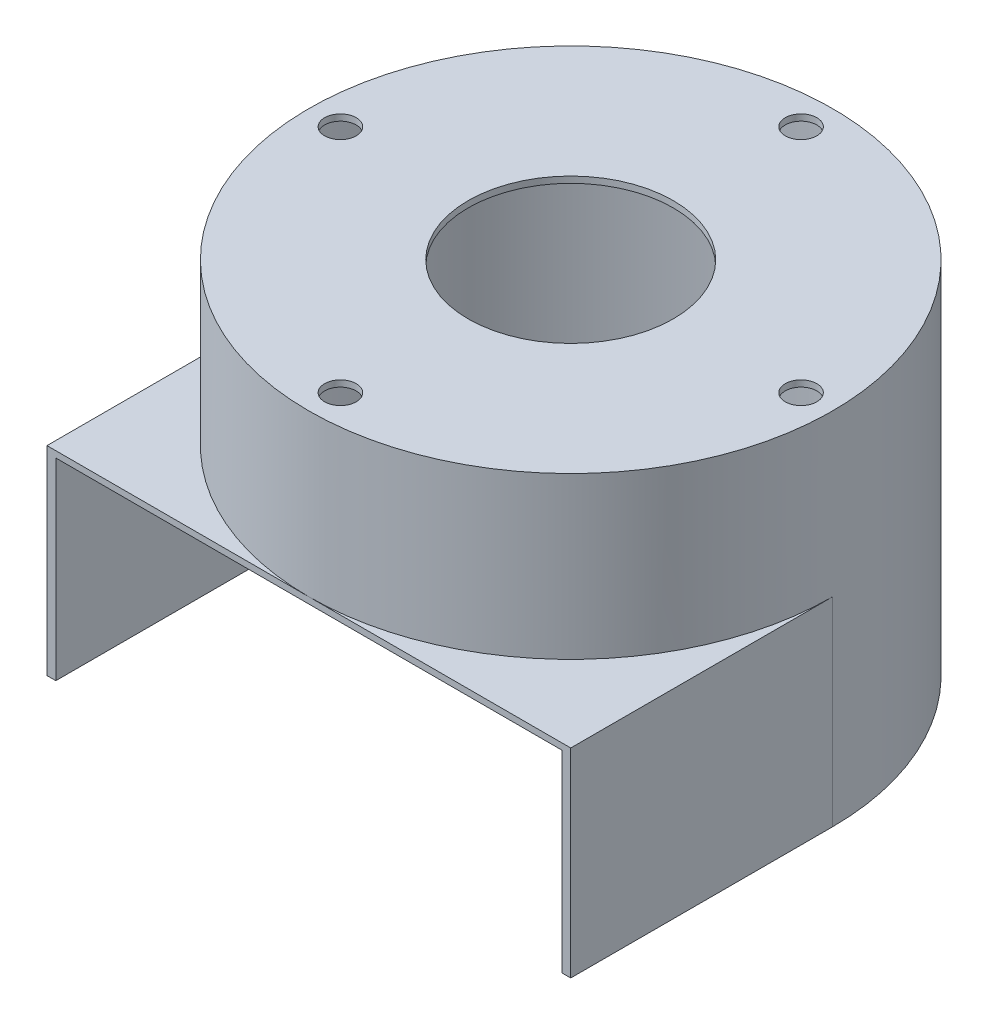
ISO-10303-21;
HEADER;
FILE_DESCRIPTION(('STEP AP214'),'2;1');
FILE_NAME('part.step','',(''),(''),'','','');
FILE_SCHEMA(('AUTOMOTIVE_DESIGN { 1 0 10303 214 1 1 1 1 }'));
ENDSEC;
DATA;
#1=APPLICATION_CONTEXT('core data for automotive mechanical design processes');
#2=APPLICATION_PROTOCOL_DEFINITION('international standard','automotive_design',2000,#1);
#3=PRODUCT_CONTEXT('',#1,'mechanical');
#4=PRODUCT('Part','Part','',(#3));
#5=PRODUCT_RELATED_PRODUCT_CATEGORY('part','',(#4));
#6=PRODUCT_DEFINITION_FORMATION('','',#4);
#7=PRODUCT_DEFINITION_CONTEXT('part definition',#1,'design');
#8=PRODUCT_DEFINITION('design','',#6,#7);
#9=PRODUCT_DEFINITION_SHAPE('','',#8);
#10=(LENGTH_UNIT() NAMED_UNIT(*) SI_UNIT(.MILLI.,.METRE.));
#11=(NAMED_UNIT(*) PLANE_ANGLE_UNIT() SI_UNIT($,.RADIAN.));
#12=(NAMED_UNIT(*) SI_UNIT($,.STERADIAN.) SOLID_ANGLE_UNIT());
#13=UNCERTAINTY_MEASURE_WITH_UNIT(LENGTH_MEASURE(1.E-05),#10,'distance_accuracy_value','');
#14=(GEOMETRIC_REPRESENTATION_CONTEXT(3) GLOBAL_UNCERTAINTY_ASSIGNED_CONTEXT((#13)) GLOBAL_UNIT_ASSIGNED_CONTEXT((#10,
#11,#12)) REPRESENTATION_CONTEXT('',''));
#15=CARTESIAN_POINT('',(0.,0.,0.));
#16=DIRECTION('',(0.,0.,1.));
#17=DIRECTION('',(1.,0.,0.));
#18=AXIS2_PLACEMENT_3D('',#15,#16,#17);
#19=CARTESIAN_POINT('',(0.,63.14,0.));
#20=DIRECTION('',(0.,1.,0.));
#21=DIRECTION('',(0.,0.,1.));
#22=AXIS2_PLACEMENT_3D('',#19,#20,#21);
#23=PLANE('',#22);
#24=CARTESIAN_POINT('',(0.,63.14,0.));
#25=DIRECTION('',(0.,1.,0.));
#26=DIRECTION('',(0.,0.,1.));
#27=AXIS2_PLACEMENT_3D('',#24,#25,#26);
#28=CIRCLE('',#27,83.);
#29=CARTESIAN_POINT('',(0.,63.14,83.));
#30=VERTEX_POINT('',#29);
#31=CARTESIAN_POINT('',(83.,63.14,0.));
#32=VERTEX_POINT('',#31);
#33=EDGE_CURVE('E57',#30,#32,#28,.T.);
#34=ORIENTED_EDGE('',*,*,#33,.F.);
#35=DIRECTION('',(1.,0.,0.));
#36=VECTOR('',#35,1.);
#37=CARTESIAN_POINT('',(-83.,63.14,83.));
#38=LINE('',#37,#36);
#39=CARTESIAN_POINT('',(83.,63.14,83.));
#40=VERTEX_POINT('',#39);
#41=EDGE_CURVE('E196',#30,#40,#38,.T.);
#42=ORIENTED_EDGE('',*,*,#41,.T.);
#43=DIRECTION('',(0.,0.,-1.));
#44=VECTOR('',#43,1.);
#45=CARTESIAN_POINT('',(83.,63.14,83.));
#46=LINE('',#45,#44);
#47=EDGE_CURVE('E154',#40,#32,#46,.T.);
#48=ORIENTED_EDGE('',*,*,#47,.T.);
#49=EDGE_LOOP('',(#34,#42,#48));
#50=FACE_BOUND('',#49,.T.);
#51=ADVANCED_FACE('F44',(#50),#23,.T.);
#52=CARTESIAN_POINT('',(0.,0.,0.));
#53=DIRECTION('',(0.,1.,0.));
#54=DIRECTION('',(0.,0.,1.));
#55=AXIS2_PLACEMENT_3D('',#52,#53,#54);
#56=PLANE('',#55);
#57=DIRECTION('',(1.,0.,0.));
#58=VECTOR('',#57,1.);
#59=CARTESIAN_POINT('',(0.,0.,83.));
#60=LINE('',#59,#58);
#61=CARTESIAN_POINT('',(80.2,0.,83.));
#62=VERTEX_POINT('',#61);
#63=CARTESIAN_POINT('',(83.,0.,83.));
#64=VERTEX_POINT('',#63);
#65=EDGE_CURVE('E87',#62,#64,#60,.T.);
#66=ORIENTED_EDGE('',*,*,#65,.F.);
#67=DIRECTION('',(0.,0.,-1.));
#68=VECTOR('',#67,1.);
#69=CARTESIAN_POINT('',(80.2,0.,80.));
#70=LINE('',#69,#68);
#71=CARTESIAN_POINT('',(80.2,0.,0.));
#72=VERTEX_POINT('',#71);
#73=EDGE_CURVE('E146',#62,#72,#70,.T.);
#74=ORIENTED_EDGE('',*,*,#73,.T.);
#75=CARTESIAN_POINT('',(0.,0.,0.));
#76=DIRECTION('',(0.,1.,0.));
#77=DIRECTION('',(0.,0.,1.));
#78=AXIS2_PLACEMENT_3D('',#75,#76,#77);
#79=CIRCLE('',#78,80.2);
#80=CARTESIAN_POINT('',(-80.2,0.,0.));
#81=VERTEX_POINT('',#80);
#82=EDGE_CURVE('E65',#72,#81,#79,.T.);
#83=ORIENTED_EDGE('',*,*,#82,.T.);
#84=DIRECTION('',(0.,0.,1.));
#85=VECTOR('',#84,1.);
#86=CARTESIAN_POINT('',(-80.2,0.,0.));
#87=LINE('',#86,#85);
#88=CARTESIAN_POINT('',(-80.2,0.,83.));
#89=VERTEX_POINT('',#88);
#90=EDGE_CURVE('E151',#81,#89,#87,.T.);
#91=ORIENTED_EDGE('',*,*,#90,.T.);
#92=CARTESIAN_POINT('',(-83.,0.,83.));
#93=VERTEX_POINT('',#92);
#94=EDGE_CURVE('E128',#93,#89,#60,.T.);
#95=ORIENTED_EDGE('',*,*,#94,.F.);
#96=DIRECTION('',(0.,0.,1.));
#97=VECTOR('',#96,1.);
#98=CARTESIAN_POINT('',(-83.,0.,0.));
#99=LINE('',#98,#97);
#100=CARTESIAN_POINT('',(-83.,0.,0.));
#101=VERTEX_POINT('',#100);
#102=EDGE_CURVE('E112',#101,#93,#99,.T.);
#103=ORIENTED_EDGE('',*,*,#102,.F.);
#104=CARTESIAN_POINT('',(0.,0.,0.));
#105=DIRECTION('',(0.,1.,0.));
#106=DIRECTION('',(0.,0.,1.));
#107=AXIS2_PLACEMENT_3D('',#104,#105,#106);
#108=CIRCLE('',#107,83.);
#109=CARTESIAN_POINT('',(83.,0.,0.));
#110=VERTEX_POINT('',#109);
#111=EDGE_CURVE('E99',#110,#101,#108,.T.);
#112=ORIENTED_EDGE('',*,*,#111,.F.);
#113=DIRECTION('',(0.,0.,-1.));
#114=VECTOR('',#113,1.);
#115=CARTESIAN_POINT('',(83.,0.,83.));
#116=LINE('',#115,#114);
#117=EDGE_CURVE('E113',#64,#110,#116,.T.);
#118=ORIENTED_EDGE('',*,*,#117,.F.);
#119=EDGE_LOOP('',(#66,#74,#83,#91,#95,#103,#112,#118));
#120=FACE_BOUND('',#119,.T.);
#121=ADVANCED_FACE('F125',(#120),#56,.F.);
#122=CARTESIAN_POINT('',(0.,61.14,83.));
#123=DIRECTION('',(0.,0.,-1.));
#124=DIRECTION('',(-1.,0.,0.));
#125=AXIS2_PLACEMENT_3D('',#122,#123,#124);
#126=PLANE('',#125);
#127=DIRECTION('',(1.,0.,0.));
#128=VECTOR('',#127,1.);
#129=CARTESIAN_POINT('',(-80.2,61.14,83.));
#130=LINE('',#129,#128);
#131=CARTESIAN_POINT('',(-80.2,61.14,83.));
#132=VERTEX_POINT('',#131);
#133=CARTESIAN_POINT('',(80.2,61.14,83.));
#134=VERTEX_POINT('',#133);
#135=EDGE_CURVE('E235',#132,#134,#130,.T.);
#136=ORIENTED_EDGE('',*,*,#135,.T.);
#137=DIRECTION('',(0.,-1.,0.));
#138=VECTOR('',#137,1.);
#139=CARTESIAN_POINT('',(80.2,61.14,83.));
#140=LINE('',#139,#138);
#141=EDGE_CURVE('E169',#134,#62,#140,.T.);
#142=ORIENTED_EDGE('',*,*,#141,.T.);
#143=ORIENTED_EDGE('',*,*,#65,.T.);
#144=DIRECTION('',(0.,-1.,0.));
#145=VECTOR('',#144,1.);
#146=CARTESIAN_POINT('',(83.,61.14,83.));
#147=LINE('',#146,#145);
#148=EDGE_CURVE('E55',#40,#64,#147,.T.);
#149=ORIENTED_EDGE('',*,*,#148,.F.);
#150=ORIENTED_EDGE('',*,*,#41,.F.);
#151=CARTESIAN_POINT('',(-83.,63.14,83.));
#152=VERTEX_POINT('',#151);
#153=EDGE_CURVE('E197',#152,#30,#38,.T.);
#154=ORIENTED_EDGE('',*,*,#153,.F.);
#155=DIRECTION('',(0.,-1.,0.));
#156=VECTOR('',#155,1.);
#157=CARTESIAN_POINT('',(-83.,61.14,83.));
#158=LINE('',#157,#156);
#159=EDGE_CURVE('E123',#152,#93,#158,.T.);
#160=ORIENTED_EDGE('',*,*,#159,.T.);
#161=ORIENTED_EDGE('',*,*,#94,.T.);
#162=DIRECTION('',(0.,1.,0.));
#163=VECTOR('',#162,1.);
#164=CARTESIAN_POINT('',(-80.2,0.,83.));
#165=LINE('',#164,#163);
#166=EDGE_CURVE('E507',#89,#132,#165,.T.);
#167=ORIENTED_EDGE('',*,*,#166,.T.);
#168=EDGE_LOOP('',(#136,#142,#143,#149,#150,#154,#160,#161,#167));
#169=FACE_BOUND('',#168,.T.);
#170=ADVANCED_FACE('F233',(#169),#126,.F.);
#171=CARTESIAN_POINT('',(83.,61.14,83.));
#172=DIRECTION('',(-1.,0.,0.));
#173=DIRECTION('',(0.,0.,1.));
#174=AXIS2_PLACEMENT_3D('',#171,#172,#173);
#175=PLANE('',#174);
#176=ORIENTED_EDGE('',*,*,#117,.T.);
#177=DIRECTION('',(0.,-1.,0.));
#178=VECTOR('',#177,1.);
#179=CARTESIAN_POINT('',(83.,61.14,0.));
#180=LINE('',#179,#178);
#181=EDGE_CURVE('E107',#32,#110,#180,.T.);
#182=ORIENTED_EDGE('',*,*,#181,.F.);
#183=ORIENTED_EDGE('',*,*,#47,.F.);
#184=ORIENTED_EDGE('',*,*,#148,.T.);
#185=EDGE_LOOP('',(#176,#182,#183,#184));
#186=FACE_BOUND('',#185,.T.);
#187=ADVANCED_FACE('F207',(#186),#175,.F.);
#188=CARTESIAN_POINT('',(0.,61.14,0.));
#189=DIRECTION('',(0.,-1.,0.));
#190=DIRECTION('',(0.,0.,-1.));
#191=AXIS2_PLACEMENT_3D('',#188,#189,#190);
#192=CYLINDRICAL_SURFACE('',#191,83.);
#193=ORIENTED_EDGE('',*,*,#111,.T.);
#194=DIRECTION('',(0.,-1.,0.));
#195=VECTOR('',#194,1.);
#196=CARTESIAN_POINT('',(-83.,61.14,0.));
#197=LINE('',#196,#195);
#198=CARTESIAN_POINT('',(-83.,63.14,0.));
#199=VERTEX_POINT('',#198);
#200=EDGE_CURVE('E103',#199,#101,#197,.T.);
#201=ORIENTED_EDGE('',*,*,#200,.F.);
#202=EDGE_CURVE('E12',#199,#30,#28,.T.);
#203=ORIENTED_EDGE('',*,*,#202,.T.);
#204=ORIENTED_EDGE('',*,*,#33,.T.);
#205=ORIENTED_EDGE('',*,*,#181,.T.);
#206=EDGE_LOOP('',(#193,#201,#203,#204,#205));
#207=FACE_BOUND('',#206,.T.);
#208=CARTESIAN_POINT('',(0.,114.15,0.));
#209=DIRECTION('',(0.,1.,0.));
#210=DIRECTION('',(0.,0.,1.));
#211=AXIS2_PLACEMENT_3D('',#208,#209,#210);
#212=CIRCLE('',#211,83.);
#213=CARTESIAN_POINT('',(0.,114.15,83.));
#214=VERTEX_POINT('',#213);
#215=EDGE_CURVE('E180',#214,#214,#212,.T.);
#216=ORIENTED_EDGE('',*,*,#215,.F.);
#217=EDGE_LOOP('',(#216));
#218=FACE_BOUND('',#217,.T.);
#219=ADVANCED_FACE('F101',(#207,#218),#192,.T.);
#220=CARTESIAN_POINT('',(-83.,61.14,0.));
#221=DIRECTION('',(1.,0.,0.));
#222=DIRECTION('',(0.,0.,-1.));
#223=AXIS2_PLACEMENT_3D('',#220,#221,#222);
#224=PLANE('',#223);
#225=ORIENTED_EDGE('',*,*,#102,.T.);
#226=ORIENTED_EDGE('',*,*,#159,.F.);
#227=DIRECTION('',(0.,0.,1.));
#228=VECTOR('',#227,1.);
#229=CARTESIAN_POINT('',(-83.,63.14,0.));
#230=LINE('',#229,#228);
#231=EDGE_CURVE('E121',#199,#152,#230,.T.);
#232=ORIENTED_EDGE('',*,*,#231,.F.);
#233=ORIENTED_EDGE('',*,*,#200,.T.);
#234=EDGE_LOOP('',(#225,#226,#232,#233));
#235=FACE_BOUND('',#234,.T.);
#236=ADVANCED_FACE('F117',(#235),#224,.F.);
#237=CARTESIAN_POINT('',(0.,61.14,0.));
#238=DIRECTION('',(0.,-1.,0.));
#239=DIRECTION('',(0.,0.,-1.));
#240=AXIS2_PLACEMENT_3D('',#237,#238,#239);
#241=CYLINDRICAL_SURFACE('',#240,80.2);
#242=ORIENTED_EDGE('',*,*,#82,.F.);
#243=DIRECTION('',(0.,1.,0.));
#244=VECTOR('',#243,1.);
#245=CARTESIAN_POINT('',(80.2,61.14,0.));
#246=LINE('',#245,#244);
#247=CARTESIAN_POINT('',(80.2,61.14,0.));
#248=VERTEX_POINT('',#247);
#249=EDGE_CURVE('E139',#248,#72,#246,.F.);
#250=ORIENTED_EDGE('',*,*,#249,.F.);
#251=CARTESIAN_POINT('',(0.,61.14,0.));
#252=DIRECTION('',(0.,1.,0.));
#253=DIRECTION('',(0.,0.,1.));
#254=AXIS2_PLACEMENT_3D('',#251,#252,#253);
#255=CIRCLE('',#254,80.2);
#256=CARTESIAN_POINT('',(-80.2,61.14,0.));
#257=VERTEX_POINT('',#256);
#258=EDGE_CURVE('E78',#257,#248,#255,.T.);
#259=ORIENTED_EDGE('',*,*,#258,.F.);
#260=DIRECTION('',(0.,-1.,0.));
#261=VECTOR('',#260,1.);
#262=CARTESIAN_POINT('',(-80.2,61.14,0.));
#263=LINE('',#262,#261);
#264=EDGE_CURVE('E142',#257,#81,#263,.T.);
#265=ORIENTED_EDGE('',*,*,#264,.T.);
#266=EDGE_LOOP('',(#242,#250,#259,#265));
#267=FACE_BOUND('',#266,.T.);
#268=CARTESIAN_POINT('',(0.,112.15,0.));
#269=DIRECTION('',(0.,1.,0.));
#270=DIRECTION('',(0.,0.,1.));
#271=AXIS2_PLACEMENT_3D('',#268,#269,#270);
#272=CIRCLE('',#271,80.2);
#273=CARTESIAN_POINT('',(0.,112.15,80.2));
#274=VERTEX_POINT('',#273);
#275=EDGE_CURVE('E48',#274,#274,#272,.T.);
#276=ORIENTED_EDGE('',*,*,#275,.T.);
#277=EDGE_LOOP('',(#276));
#278=FACE_BOUND('',#277,.T.);
#279=ADVANCED_FACE('F46',(#267,#278),#241,.F.);
#280=CARTESIAN_POINT('',(-80.2,61.14,0.));
#281=DIRECTION('',(1.,0.,0.));
#282=DIRECTION('',(0.,0.,-1.));
#283=AXIS2_PLACEMENT_3D('',#280,#281,#282);
#284=PLANE('',#283);
#285=ORIENTED_EDGE('',*,*,#90,.F.);
#286=ORIENTED_EDGE('',*,*,#264,.F.);
#287=DIRECTION('',(0.,0.,1.));
#288=VECTOR('',#287,1.);
#289=CARTESIAN_POINT('',(-80.2,61.14,0.));
#290=LINE('',#289,#288);
#291=EDGE_CURVE('E150',#257,#132,#290,.T.);
#292=ORIENTED_EDGE('',*,*,#291,.T.);
#293=ORIENTED_EDGE('',*,*,#166,.F.);
#294=EDGE_LOOP('',(#285,#286,#292,#293));
#295=FACE_BOUND('',#294,.T.);
#296=ADVANCED_FACE('F175',(#295),#284,.T.);
#297=CARTESIAN_POINT('',(80.2,61.14,80.));
#298=DIRECTION('',(-1.,0.,0.));
#299=DIRECTION('',(0.,0.,1.));
#300=AXIS2_PLACEMENT_3D('',#297,#298,#299);
#301=PLANE('',#300);
#302=ORIENTED_EDGE('',*,*,#73,.F.);
#303=ORIENTED_EDGE('',*,*,#141,.F.);
#304=DIRECTION('',(0.,0.,-1.));
#305=VECTOR('',#304,1.);
#306=CARTESIAN_POINT('',(80.2,61.14,80.));
#307=LINE('',#306,#305);
#308=EDGE_CURVE('E143',#134,#248,#307,.T.);
#309=ORIENTED_EDGE('',*,*,#308,.T.);
#310=ORIENTED_EDGE('',*,*,#249,.T.);
#311=EDGE_LOOP('',(#302,#303,#309,#310));
#312=FACE_BOUND('',#311,.T.);
#313=ADVANCED_FACE('F167',(#312),#301,.T.);
#314=CARTESIAN_POINT('',(0.,61.14,0.));
#315=DIRECTION('',(0.,1.,0.));
#316=DIRECTION('',(0.,0.,1.));
#317=AXIS2_PLACEMENT_3D('',#314,#315,#316);
#318=PLANE('',#317);
#319=ORIENTED_EDGE('',*,*,#291,.F.);
#320=ORIENTED_EDGE('',*,*,#258,.T.);
#321=ORIENTED_EDGE('',*,*,#308,.F.);
#322=ORIENTED_EDGE('',*,*,#135,.F.);
#323=EDGE_LOOP('',(#319,#320,#321,#322));
#324=FACE_BOUND('',#323,.T.);
#325=ADVANCED_FACE('F253',(#324),#318,.F.);
#326=ORIENTED_EDGE('',*,*,#202,.F.);
#327=ORIENTED_EDGE('',*,*,#231,.T.);
#328=ORIENTED_EDGE('',*,*,#153,.T.);
#329=EDGE_LOOP('',(#326,#327,#328));
#330=FACE_BOUND('',#329,.T.);
#331=ADVANCED_FACE('F227',(#330),#23,.T.);
#332=CARTESIAN_POINT('',(0.,112.15,0.));
#333=DIRECTION('',(0.,1.,0.));
#334=DIRECTION('',(0.,0.,1.));
#335=AXIS2_PLACEMENT_3D('',#332,#333,#334);
#336=PLANE('',#335);
#337=CARTESIAN_POINT('',(0.,112.15,-73.));
#338=DIRECTION('',(0.,1.,0.));
#339=DIRECTION('',(0.,0.,1.));
#340=AXIS2_PLACEMENT_3D('',#337,#338,#339);
#341=CIRCLE('',#340,5.);
#342=CARTESIAN_POINT('',(0.,112.15,-68.));
#343=VERTEX_POINT('',#342);
#344=EDGE_CURVE('E473',#343,#343,#341,.T.);
#345=ORIENTED_EDGE('',*,*,#344,.T.);
#346=EDGE_LOOP('',(#345));
#347=FACE_BOUND('',#346,.T.);
#348=CARTESIAN_POINT('',(73.,112.15,2.54878137735549E-13));
#349=DIRECTION('',(0.,1.,0.));
#350=DIRECTION('',(0.,0.,1.));
#351=AXIS2_PLACEMENT_3D('',#348,#349,#350);
#352=CIRCLE('',#351,5.);
#353=CARTESIAN_POINT('',(73.,112.15,5.00000000000026));
#354=VERTEX_POINT('',#353);
#355=EDGE_CURVE('E475',#354,#354,#352,.T.);
#356=ORIENTED_EDGE('',*,*,#355,.T.);
#357=EDGE_LOOP('',(#356));
#358=FACE_BOUND('',#357,.T.);
#359=CARTESIAN_POINT('',(-5.09756275471097E-13,112.15,73.));
#360=DIRECTION('',(0.,1.,0.));
#361=DIRECTION('',(0.,0.,1.));
#362=AXIS2_PLACEMENT_3D('',#359,#360,#361);
#363=CIRCLE('',#362,5.);
#364=CARTESIAN_POINT('',(-5.09756275471097E-13,112.15,78.));
#365=VERTEX_POINT('',#364);
#366=EDGE_CURVE('E481',#365,#365,#363,.T.);
#367=ORIENTED_EDGE('',*,*,#366,.T.);
#368=EDGE_LOOP('',(#367));
#369=FACE_BOUND('',#368,.T.);
#370=CARTESIAN_POINT('',(-73.,112.15,-7.64634413206646E-13));
#371=DIRECTION('',(0.,1.,0.));
#372=DIRECTION('',(0.,0.,1.));
#373=AXIS2_PLACEMENT_3D('',#370,#371,#372);
#374=CIRCLE('',#373,5.);
#375=CARTESIAN_POINT('',(-73.,112.15,4.99999999999924));
#376=VERTEX_POINT('',#375);
#377=EDGE_CURVE('E487',#376,#376,#374,.T.);
#378=ORIENTED_EDGE('',*,*,#377,.T.);
#379=EDGE_LOOP('',(#378));
#380=FACE_BOUND('',#379,.T.);
#381=CARTESIAN_POINT('',(0.,112.15,0.));
#382=DIRECTION('',(0.,1.,0.));
#383=DIRECTION('',(0.,0.,1.));
#384=AXIS2_PLACEMENT_3D('',#381,#382,#383);
#385=CIRCLE('',#384,32.5);
#386=CARTESIAN_POINT('',(0.,112.15,32.5));
#387=VERTEX_POINT('',#386);
#388=EDGE_CURVE('E190',#387,#387,#385,.T.);
#389=ORIENTED_EDGE('',*,*,#388,.T.);
#390=EDGE_LOOP('',(#389));
#391=FACE_BOUND('',#390,.T.);
#392=ORIENTED_EDGE('',*,*,#275,.F.);
#393=EDGE_LOOP('',(#392));
#394=FACE_BOUND('',#393,.T.);
#395=ADVANCED_FACE('F252',(#347,#358,#369,#380,#391,#394),#336,.F.);
#396=CARTESIAN_POINT('',(0.,114.15,0.));
#397=DIRECTION('',(0.,1.,0.));
#398=DIRECTION('',(0.,0.,1.));
#399=AXIS2_PLACEMENT_3D('',#396,#397,#398);
#400=PLANE('',#399);
#401=CARTESIAN_POINT('',(0.,114.15,-73.));
#402=DIRECTION('',(0.,1.,0.));
#403=DIRECTION('',(0.,0.,1.));
#404=AXIS2_PLACEMENT_3D('',#401,#402,#403);
#405=CIRCLE('',#404,5.);
#406=CARTESIAN_POINT('',(0.,114.15,-68.));
#407=VERTEX_POINT('',#406);
#408=EDGE_CURVE('E470',#407,#407,#405,.T.);
#409=ORIENTED_EDGE('',*,*,#408,.F.);
#410=EDGE_LOOP('',(#409));
#411=FACE_BOUND('',#410,.T.);
#412=CARTESIAN_POINT('',(73.,114.15,2.54878137735549E-13));
#413=DIRECTION('',(0.,1.,0.));
#414=DIRECTION('',(0.,0.,1.));
#415=AXIS2_PLACEMENT_3D('',#412,#413,#414);
#416=CIRCLE('',#415,5.);
#417=CARTESIAN_POINT('',(73.,114.15,5.00000000000026));
#418=VERTEX_POINT('',#417);
#419=EDGE_CURVE('E499',#418,#418,#416,.T.);
#420=ORIENTED_EDGE('',*,*,#419,.F.);
#421=EDGE_LOOP('',(#420));
#422=FACE_BOUND('',#421,.T.);
#423=CARTESIAN_POINT('',(-5.09756275471097E-13,114.15,73.));
#424=DIRECTION('',(0.,1.,0.));
#425=DIRECTION('',(0.,0.,1.));
#426=AXIS2_PLACEMENT_3D('',#423,#424,#425);
#427=CIRCLE('',#426,5.);
#428=CARTESIAN_POINT('',(-5.09756275471097E-13,114.15,78.));
#429=VERTEX_POINT('',#428);
#430=EDGE_CURVE('E495',#429,#429,#427,.T.);
#431=ORIENTED_EDGE('',*,*,#430,.F.);
#432=EDGE_LOOP('',(#431));
#433=FACE_BOUND('',#432,.T.);
#434=CARTESIAN_POINT('',(-73.,114.15,-7.64634413206646E-13));
#435=DIRECTION('',(0.,1.,0.));
#436=DIRECTION('',(0.,0.,1.));
#437=AXIS2_PLACEMENT_3D('',#434,#435,#436);
#438=CIRCLE('',#437,5.);
#439=CARTESIAN_POINT('',(-73.,114.15,4.99999999999924));
#440=VERTEX_POINT('',#439);
#441=EDGE_CURVE('E491',#440,#440,#438,.T.);
#442=ORIENTED_EDGE('',*,*,#441,.F.);
#443=EDGE_LOOP('',(#442));
#444=FACE_BOUND('',#443,.T.);
#445=ORIENTED_EDGE('',*,*,#215,.T.);
#446=EDGE_LOOP('',(#445));
#447=FACE_BOUND('',#446,.T.);
#448=CARTESIAN_POINT('',(0.,114.15,0.));
#449=DIRECTION('',(0.,1.,0.));
#450=DIRECTION('',(0.,0.,1.));
#451=AXIS2_PLACEMENT_3D('',#448,#449,#450);
#452=CIRCLE('',#451,32.5);
#453=CARTESIAN_POINT('',(0.,114.15,32.5));
#454=VERTEX_POINT('',#453);
#455=EDGE_CURVE('E184',#454,#454,#452,.T.);
#456=ORIENTED_EDGE('',*,*,#455,.F.);
#457=EDGE_LOOP('',(#456));
#458=FACE_BOUND('',#457,.T.);
#459=ADVANCED_FACE('F258',(#411,#422,#433,#444,#447,#458),#400,.T.);
#460=CARTESIAN_POINT('',(0.,114.15,0.));
#461=DIRECTION('',(0.,-1.,0.));
#462=DIRECTION('',(0.,0.,-1.));
#463=AXIS2_PLACEMENT_3D('',#460,#461,#462);
#464=CYLINDRICAL_SURFACE('',#463,32.5);
#465=ORIENTED_EDGE('',*,*,#455,.T.);
#466=EDGE_LOOP('',(#465));
#467=FACE_BOUND('',#466,.T.);
#468=ORIENTED_EDGE('',*,*,#388,.F.);
#469=EDGE_LOOP('',(#468));
#470=FACE_BOUND('',#469,.T.);
#471=ADVANCED_FACE('F349',(#467,#470),#464,.F.);
#472=CARTESIAN_POINT('',(-73.,0.,-7.64634413206646E-13));
#473=DIRECTION('',(0.,1.,0.));
#474=DIRECTION('',(0.,0.,1.));
#475=AXIS2_PLACEMENT_3D('',#472,#473,#474);
#476=CYLINDRICAL_SURFACE('',#475,5.);
#477=ORIENTED_EDGE('',*,*,#441,.T.);
#478=EDGE_LOOP('',(#477));
#479=FACE_BOUND('',#478,.T.);
#480=ORIENTED_EDGE('',*,*,#377,.F.);
#481=EDGE_LOOP('',(#480));
#482=FACE_BOUND('',#481,.T.);
#483=ADVANCED_FACE('F360',(#479,#482),#476,.F.);
#484=CARTESIAN_POINT('',(-5.09756275471097E-13,0.,73.));
#485=DIRECTION('',(0.,1.,0.));
#486=DIRECTION('',(0.,0.,1.));
#487=AXIS2_PLACEMENT_3D('',#484,#485,#486);
#488=CYLINDRICAL_SURFACE('',#487,5.);
#489=ORIENTED_EDGE('',*,*,#430,.T.);
#490=EDGE_LOOP('',(#489));
#491=FACE_BOUND('',#490,.T.);
#492=ORIENTED_EDGE('',*,*,#366,.F.);
#493=EDGE_LOOP('',(#492));
#494=FACE_BOUND('',#493,.T.);
#495=ADVANCED_FACE('F370',(#491,#494),#488,.F.);
#496=CARTESIAN_POINT('',(73.,0.,2.54878137735549E-13));
#497=DIRECTION('',(0.,1.,0.));
#498=DIRECTION('',(0.,0.,1.));
#499=AXIS2_PLACEMENT_3D('',#496,#497,#498);
#500=CYLINDRICAL_SURFACE('',#499,5.);
#501=ORIENTED_EDGE('',*,*,#419,.T.);
#502=EDGE_LOOP('',(#501));
#503=FACE_BOUND('',#502,.T.);
#504=ORIENTED_EDGE('',*,*,#355,.F.);
#505=EDGE_LOOP('',(#504));
#506=FACE_BOUND('',#505,.T.);
#507=ADVANCED_FACE('F381',(#503,#506),#500,.F.);
#508=CARTESIAN_POINT('',(0.,0.,-73.));
#509=DIRECTION('',(0.,1.,0.));
#510=DIRECTION('',(0.,0.,1.));
#511=AXIS2_PLACEMENT_3D('',#508,#509,#510);
#512=CYLINDRICAL_SURFACE('',#511,5.);
#513=ORIENTED_EDGE('',*,*,#408,.T.);
#514=EDGE_LOOP('',(#513));
#515=FACE_BOUND('',#514,.T.);
#516=ORIENTED_EDGE('',*,*,#344,.F.);
#517=EDGE_LOOP('',(#516));
#518=FACE_BOUND('',#517,.T.);
#519=ADVANCED_FACE('F392',(#515,#518),#512,.F.);
#520=CLOSED_SHELL('',(#51,#121,#170,#187,#219,#236,#279,#296,#313,#325,#331,#395,#459,#471,#483,
#495,#507,#519));
#521=MANIFOLD_SOLID_BREP('B2',#520);
#522=ADVANCED_BREP_SHAPE_REPRESENTATION('',(#18,#521),#14);
#523=SHAPE_DEFINITION_REPRESENTATION(#9,#522);
ENDSEC;
END-ISO-10303-21;
